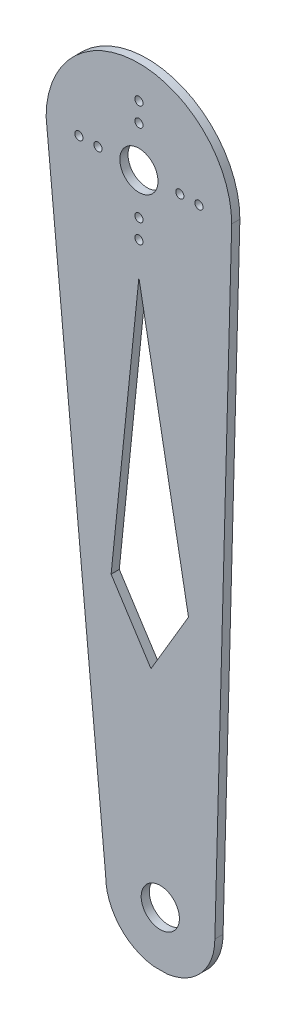
ISO-10303-21;
HEADER;
FILE_DESCRIPTION(('STEP AP214'),'2;1');
FILE_NAME('part.step','',(''),(''),'','','');
FILE_SCHEMA(('AUTOMOTIVE_DESIGN { 1 0 10303 214 1 1 1 1 }'));
ENDSEC;
DATA;
#1=APPLICATION_CONTEXT('core data for automotive mechanical design processes');
#2=APPLICATION_PROTOCOL_DEFINITION('international standard','automotive_design',2000,#1);
#3=PRODUCT_CONTEXT('',#1,'mechanical');
#4=PRODUCT('Part','Part','',(#3));
#5=PRODUCT_RELATED_PRODUCT_CATEGORY('part','',(#4));
#6=PRODUCT_DEFINITION_FORMATION('','',#4);
#7=PRODUCT_DEFINITION_CONTEXT('part definition',#1,'design');
#8=PRODUCT_DEFINITION('design','',#6,#7);
#9=PRODUCT_DEFINITION_SHAPE('','',#8);
#10=(LENGTH_UNIT() NAMED_UNIT(*) SI_UNIT(.MILLI.,.METRE.));
#11=(NAMED_UNIT(*) PLANE_ANGLE_UNIT() SI_UNIT($,.RADIAN.));
#12=(NAMED_UNIT(*) SI_UNIT($,.STERADIAN.) SOLID_ANGLE_UNIT());
#13=UNCERTAINTY_MEASURE_WITH_UNIT(LENGTH_MEASURE(1.E-05),#10,'distance_accuracy_value','');
#14=(GEOMETRIC_REPRESENTATION_CONTEXT(3) GLOBAL_UNCERTAINTY_ASSIGNED_CONTEXT((#13)) GLOBAL_UNIT_ASSIGNED_CONTEXT((#10,
#11,#12)) REPRESENTATION_CONTEXT('',''));
#15=CARTESIAN_POINT('',(0.,0.,0.));
#16=DIRECTION('',(0.,0.,1.));
#17=DIRECTION('',(1.,0.,0.));
#18=AXIS2_PLACEMENT_3D('',#15,#16,#17);
#19=CARTESIAN_POINT('',(-25.5183201991251,-249.856080790033,3.));
#20=DIRECTION('',(0.,1.,0.));
#21=DIRECTION('',(-1.,0.,0.));
#22=AXIS2_PLACEMENT_3D('',#19,#20,#21);
#23=PLANE('',#22);
#24=DIRECTION('',(0.,0.,1.));
#25=VECTOR('',#24,1.);
#26=CARTESIAN_POINT('',(10.3611541963487,-249.856080790033,0.));
#27=LINE('',#26,#25);
#28=CARTESIAN_POINT('',(10.3611541963487,-249.856080790033,0.));
#29=VERTEX_POINT('',#28);
#30=CARTESIAN_POINT('',(10.3611541963487,-249.856080790033,3.));
#31=VERTEX_POINT('',#30);
#32=EDGE_CURVE('E241',#29,#31,#27,.T.);
#33=ORIENTED_EDGE('',*,*,#32,.T.);
#34=DIRECTION('',(1.,0.,0.));
#35=VECTOR('',#34,1.);
#36=CARTESIAN_POINT('',(-25.5183201991251,-249.856080790033,3.));
#37=LINE('',#36,#35);
#38=CARTESIAN_POINT('',(5.29446066926904,-249.856080790033,3.));
#39=VERTEX_POINT('',#38);
#40=EDGE_CURVE('E279',#39,#31,#37,.T.);
#41=ORIENTED_EDGE('',*,*,#40,.F.);
#42=DIRECTION('',(0.,0.,1.));
#43=VECTOR('',#42,1.);
#44=CARTESIAN_POINT('',(5.29446066926904,-249.856080790033,0.));
#45=LINE('',#44,#43);
#46=CARTESIAN_POINT('',(5.29446066926904,-249.856080790033,0.));
#47=VERTEX_POINT('',#46);
#48=EDGE_CURVE('E269',#47,#39,#45,.T.);
#49=ORIENTED_EDGE('',*,*,#48,.F.);
#50=DIRECTION('',(1.,0.,0.));
#51=VECTOR('',#50,1.);
#52=CARTESIAN_POINT('',(-25.5183201991251,-249.856080790033,0.));
#53=LINE('',#52,#51);
#54=EDGE_CURVE('E280',#47,#29,#53,.T.);
#55=ORIENTED_EDGE('',*,*,#54,.T.);
#56=EDGE_LOOP('',(#33,#41,#49,#55));
#57=FACE_BOUND('',#56,.T.);
#58=ADVANCED_FACE('F38',(#57),#23,.F.);
#59=CARTESIAN_POINT('',(0.,0.,3.));
#60=DIRECTION('',(0.,0.,-1.));
#61=DIRECTION('',(-1.,0.,0.));
#62=AXIS2_PLACEMENT_3D('',#59,#60,#61);
#63=PLANE('',#62);
#64=CARTESIAN_POINT('',(0.,0.,3.));
#65=DIRECTION('',(0.,0.,1.));
#66=DIRECTION('',(1.,0.,0.));
#67=AXIS2_PLACEMENT_3D('',#64,#65,#66);
#68=CIRCLE('',#67,7.);
#69=CARTESIAN_POINT('',(7.,0.,3.));
#70=VERTEX_POINT('',#69);
#71=EDGE_CURVE('E394',#70,#70,#68,.T.);
#72=ORIENTED_EDGE('',*,*,#71,.F.);
#73=EDGE_LOOP('',(#72));
#74=FACE_BOUND('',#73,.T.);
#75=CARTESIAN_POINT('',(7.82780743280886,-230.017175725094,3.));
#76=DIRECTION('',(0.,0.,1.));
#77=DIRECTION('',(1.,0.,0.));
#78=AXIS2_PLACEMENT_3D('',#75,#76,#77);
#79=CIRCLE('',#78,7.);
#80=CARTESIAN_POINT('',(14.8278074328089,-230.017175725094,3.));
#81=VERTEX_POINT('',#80);
#82=EDGE_CURVE('E144',#81,#81,#79,.T.);
#83=ORIENTED_EDGE('',*,*,#82,.F.);
#84=EDGE_LOOP('',(#83));
#85=FACE_BOUND('',#84,.T.);
#86=DIRECTION('',(-0.102087088362286,-0.99477546531351,0.));
#87=VECTOR('',#86,1.);
#88=CARTESIAN_POINT('',(0.,-34.,3.));
#89=LINE('',#88,#87);
#90=CARTESIAN_POINT('',(0.,-34.,3.));
#91=VERTEX_POINT('',#90);
#92=CARTESIAN_POINT('',(-10.1834723270797,-133.231632375758,3.));
#93=VERTEX_POINT('',#92);
#94=EDGE_CURVE('E153',#91,#93,#89,.T.);
#95=ORIENTED_EDGE('',*,*,#94,.F.);
#96=DIRECTION('',(-0.181020469116553,0.983479328588468,0.));
#97=VECTOR('',#96,1.);
#98=CARTESIAN_POINT('',(18.1669669850263,-132.700641867295,3.));
#99=LINE('',#98,#97);
#100=CARTESIAN_POINT('',(18.1669669850263,-132.700641867295,3.));
#101=VERTEX_POINT('',#100);
#102=EDGE_CURVE('E55',#101,#91,#99,.T.);
#103=ORIENTED_EDGE('',*,*,#102,.F.);
#104=DIRECTION('',(0.509071340543414,0.860724328828535,0.));
#105=VECTOR('',#104,1.);
#106=CARTESIAN_POINT('',(4.42204079035416,-155.940198745665,3.));
#107=LINE('',#106,#105);
#108=CARTESIAN_POINT('',(4.42204079035416,-155.940198745665,3.));
#109=VERTEX_POINT('',#108);
#110=EDGE_CURVE('E137',#109,#101,#107,.T.);
#111=ORIENTED_EDGE('',*,*,#110,.F.);
#112=DIRECTION('',(0.540944930275327,-0.841058013700257,0.));
#113=VECTOR('',#112,1.);
#114=CARTESIAN_POINT('',(-10.1834723270797,-133.231632375758,3.));
#115=LINE('',#114,#113);
#116=EDGE_CURVE('E141',#93,#109,#115,.T.);
#117=ORIENTED_EDGE('',*,*,#116,.F.);
#118=EDGE_LOOP('',(#95,#103,#111,#117));
#119=FACE_BOUND('',#118,.T.);
#120=CARTESIAN_POINT('',(0.,22.,3.));
#121=DIRECTION('',(0.,0.,1.));
#122=DIRECTION('',(1.,0.,0.));
#123=AXIS2_PLACEMENT_3D('',#120,#121,#122);
#124=CIRCLE('',#123,1.5);
#125=CARTESIAN_POINT('',(1.5,22.,3.));
#126=VERTEX_POINT('',#125);
#127=EDGE_CURVE('E174',#126,#126,#124,.T.);
#128=ORIENTED_EDGE('',*,*,#127,.F.);
#129=EDGE_LOOP('',(#128));
#130=FACE_BOUND('',#129,.T.);
#131=CARTESIAN_POINT('',(0.,-22.,3.));
#132=DIRECTION('',(0.,0.,1.));
#133=DIRECTION('',(1.,0.,0.));
#134=AXIS2_PLACEMENT_3D('',#131,#132,#133);
#135=CIRCLE('',#134,1.5);
#136=CARTESIAN_POINT('',(1.5,-22.,3.));
#137=VERTEX_POINT('',#136);
#138=EDGE_CURVE('E163',#137,#137,#135,.T.);
#139=ORIENTED_EDGE('',*,*,#138,.F.);
#140=EDGE_LOOP('',(#139));
#141=FACE_BOUND('',#140,.T.);
#142=CARTESIAN_POINT('',(22.,0.,3.));
#143=DIRECTION('',(0.,0.,1.));
#144=DIRECTION('',(1.,0.,0.));
#145=AXIS2_PLACEMENT_3D('',#142,#143,#144);
#146=CIRCLE('',#145,1.5);
#147=CARTESIAN_POINT('',(23.5,0.,3.));
#148=VERTEX_POINT('',#147);
#149=EDGE_CURVE('E192',#148,#148,#146,.T.);
#150=ORIENTED_EDGE('',*,*,#149,.F.);
#151=EDGE_LOOP('',(#150));
#152=FACE_BOUND('',#151,.T.);
#153=CARTESIAN_POINT('',(15.,0.,3.));
#154=DIRECTION('',(0.,0.,1.));
#155=DIRECTION('',(1.,0.,0.));
#156=AXIS2_PLACEMENT_3D('',#153,#154,#155);
#157=CIRCLE('',#156,1.5);
#158=CARTESIAN_POINT('',(16.5,0.,3.));
#159=VERTEX_POINT('',#158);
#160=EDGE_CURVE('E184',#159,#159,#157,.T.);
#161=ORIENTED_EDGE('',*,*,#160,.F.);
#162=EDGE_LOOP('',(#161));
#163=FACE_BOUND('',#162,.T.);
#164=CARTESIAN_POINT('',(0.,15.,3.));
#165=DIRECTION('',(0.,0.,1.));
#166=DIRECTION('',(1.,0.,0.));
#167=AXIS2_PLACEMENT_3D('',#164,#165,#166);
#168=CIRCLE('',#167,1.5);
#169=CARTESIAN_POINT('',(1.5,15.,3.));
#170=VERTEX_POINT('',#169);
#171=EDGE_CURVE('E222',#170,#170,#168,.T.);
#172=ORIENTED_EDGE('',*,*,#171,.F.);
#173=EDGE_LOOP('',(#172));
#174=FACE_BOUND('',#173,.T.);
#175=CARTESIAN_POINT('',(-22.,0.,3.));
#176=DIRECTION('',(0.,0.,1.));
#177=DIRECTION('',(1.,0.,0.));
#178=AXIS2_PLACEMENT_3D('',#175,#176,#177);
#179=CIRCLE('',#178,1.5);
#180=CARTESIAN_POINT('',(-20.5,0.,3.));
#181=VERTEX_POINT('',#180);
#182=EDGE_CURVE('E207',#181,#181,#179,.T.);
#183=ORIENTED_EDGE('',*,*,#182,.F.);
#184=EDGE_LOOP('',(#183));
#185=FACE_BOUND('',#184,.T.);
#186=CARTESIAN_POINT('',(-15.,0.,3.));
#187=DIRECTION('',(0.,0.,1.));
#188=DIRECTION('',(1.,0.,0.));
#189=AXIS2_PLACEMENT_3D('',#186,#187,#188);
#190=CIRCLE('',#189,1.5);
#191=CARTESIAN_POINT('',(-13.5,0.,3.));
#192=VERTEX_POINT('',#191);
#193=EDGE_CURVE('E208',#192,#192,#190,.T.);
#194=ORIENTED_EDGE('',*,*,#193,.F.);
#195=EDGE_LOOP('',(#194));
#196=FACE_BOUND('',#195,.T.);
#197=CARTESIAN_POINT('',(0.,-15.,3.));
#198=DIRECTION('',(0.,0.,1.));
#199=DIRECTION('',(1.,0.,0.));
#200=AXIS2_PLACEMENT_3D('',#197,#198,#199);
#201=CIRCLE('',#200,1.5);
#202=CARTESIAN_POINT('',(1.5,-15.,3.));
#203=VERTEX_POINT('',#202);
#204=EDGE_CURVE('E183',#203,#203,#201,.T.);
#205=ORIENTED_EDGE('',*,*,#204,.F.);
#206=EDGE_LOOP('',(#205));
#207=FACE_BOUND('',#206,.T.);
#208=CARTESIAN_POINT('',(7.82780743280886,-230.017175725094,3.));
#209=DIRECTION('',(0.,0.,1.));
#210=DIRECTION('',(1.,0.,0.));
#211=AXIS2_PLACEMENT_3D('',#208,#209,#210);
#212=CIRCLE('',#211,20.);
#213=CARTESIAN_POINT('',(27.8278074328089,-230.017175725094,3.));
#214=VERTEX_POINT('',#213);
#215=EDGE_CURVE('E173',#31,#214,#212,.T.);
#216=ORIENTED_EDGE('',*,*,#215,.T.);
#217=DIRECTION('',(-0.0268239605376165,-0.999640172832743,0.));
#218=VECTOR('',#217,1.);
#219=CARTESIAN_POINT('',(33.9755361547966,-0.911686490627974,3.));
#220=LINE('',#219,#218);
#221=CARTESIAN_POINT('',(34.,0.,3.));
#222=VERTEX_POINT('',#221);
#223=EDGE_CURVE('E237',#222,#214,#220,.T.);
#224=ORIENTED_EDGE('',*,*,#223,.F.);
#225=CARTESIAN_POINT('',(0.,0.,3.));
#226=DIRECTION('',(0.,0.,1.));
#227=DIRECTION('',(-1.,0.,0.));
#228=AXIS2_PLACEMENT_3D('',#225,#226,#227);
#229=CIRCLE('',#228,34.);
#230=CARTESIAN_POINT('',(-34.,0.,3.));
#231=VERTEX_POINT('',#230);
#232=EDGE_CURVE('E275',#222,#231,#229,.T.);
#233=ORIENTED_EDGE('',*,*,#232,.T.);
#234=DIRECTION('',(0.0944720015300833,-0.995527518919944,0.));
#235=VECTOR('',#234,1.);
#236=CARTESIAN_POINT('',(-33.6965513915146,-3.19768222788193,3.));
#237=LINE('',#236,#235);
#238=CARTESIAN_POINT('',(-12.1721925671912,-230.017175725094,3.));
#239=VERTEX_POINT('',#238);
#240=EDGE_CURVE('E259',#231,#239,#237,.T.);
#241=ORIENTED_EDGE('',*,*,#240,.T.);
#242=CARTESIAN_POINT('',(7.82780743280886,-230.017175725094,3.));
#243=DIRECTION('',(0.,0.,1.));
#244=DIRECTION('',(1.,0.,0.));
#245=AXIS2_PLACEMENT_3D('',#242,#243,#244);
#246=CIRCLE('',#245,20.);
#247=EDGE_CURVE('E251',#239,#39,#246,.T.);
#248=ORIENTED_EDGE('',*,*,#247,.T.);
#249=ORIENTED_EDGE('',*,*,#40,.T.);
#250=EDGE_LOOP('',(#216,#224,#233,#241,#248,#249));
#251=FACE_BOUND('',#250,.T.);
#252=ADVANCED_FACE('F312',(#74,#85,#119,#130,#141,#152,#163,#174,#185,#196,#207,#251),#63,.F.);
#253=CARTESIAN_POINT('',(0.,0.,0.));
#254=DIRECTION('',(0.,0.,-1.));
#255=DIRECTION('',(-1.,0.,0.));
#256=AXIS2_PLACEMENT_3D('',#253,#254,#255);
#257=PLANE('',#256);
#258=CARTESIAN_POINT('',(0.,0.,0.));
#259=DIRECTION('',(0.,0.,-1.));
#260=DIRECTION('',(-1.,0.,0.));
#261=AXIS2_PLACEMENT_3D('',#258,#259,#260);
#262=CIRCLE('',#261,7.);
#263=CARTESIAN_POINT('',(-7.,0.,0.));
#264=VERTEX_POINT('',#263);
#265=EDGE_CURVE('E42',#264,#264,#262,.T.);
#266=ORIENTED_EDGE('',*,*,#265,.F.);
#267=EDGE_LOOP('',(#266));
#268=FACE_BOUND('',#267,.T.);
#269=CARTESIAN_POINT('',(7.82780743280886,-230.017175725094,0.));
#270=DIRECTION('',(0.,0.,1.));
#271=DIRECTION('',(1.,0.,0.));
#272=AXIS2_PLACEMENT_3D('',#269,#270,#271);
#273=CIRCLE('',#272,7.);
#274=CARTESIAN_POINT('',(14.8278074328089,-230.017175725094,0.));
#275=VERTEX_POINT('',#274);
#276=EDGE_CURVE('E154',#275,#275,#273,.T.);
#277=ORIENTED_EDGE('',*,*,#276,.T.);
#278=EDGE_LOOP('',(#277));
#279=FACE_BOUND('',#278,.T.);
#280=DIRECTION('',(-0.181020469116553,0.983479328588468,0.));
#281=VECTOR('',#280,1.);
#282=CARTESIAN_POINT('',(18.1669669850263,-132.700641867295,0.));
#283=LINE('',#282,#281);
#284=CARTESIAN_POINT('',(18.1669669850263,-132.700641867295,0.));
#285=VERTEX_POINT('',#284);
#286=CARTESIAN_POINT('',(0.,-34.,0.));
#287=VERTEX_POINT('',#286);
#288=EDGE_CURVE('E118',#285,#287,#283,.T.);
#289=ORIENTED_EDGE('',*,*,#288,.T.);
#290=DIRECTION('',(-0.102087088362286,-0.99477546531351,0.));
#291=VECTOR('',#290,1.);
#292=CARTESIAN_POINT('',(0.,-34.,0.));
#293=LINE('',#292,#291);
#294=CARTESIAN_POINT('',(-10.1834723270797,-133.231632375758,0.));
#295=VERTEX_POINT('',#294);
#296=EDGE_CURVE('E128',#287,#295,#293,.T.);
#297=ORIENTED_EDGE('',*,*,#296,.T.);
#298=DIRECTION('',(0.540944930275327,-0.841058013700257,0.));
#299=VECTOR('',#298,1.);
#300=CARTESIAN_POINT('',(-10.1834723270797,-133.231632375758,0.));
#301=LINE('',#300,#299);
#302=CARTESIAN_POINT('',(4.42204079035416,-155.940198745665,0.));
#303=VERTEX_POINT('',#302);
#304=EDGE_CURVE('E63',#295,#303,#301,.T.);
#305=ORIENTED_EDGE('',*,*,#304,.T.);
#306=DIRECTION('',(0.509071340543414,0.860724328828535,0.));
#307=VECTOR('',#306,1.);
#308=CARTESIAN_POINT('',(4.42204079035416,-155.940198745665,0.));
#309=LINE('',#308,#307);
#310=EDGE_CURVE('E125',#303,#285,#309,.T.);
#311=ORIENTED_EDGE('',*,*,#310,.T.);
#312=EDGE_LOOP('',(#289,#297,#305,#311));
#313=FACE_BOUND('',#312,.T.);
#314=CARTESIAN_POINT('',(0.,22.,0.));
#315=DIRECTION('',(0.,0.,1.));
#316=DIRECTION('',(1.,0.,0.));
#317=AXIS2_PLACEMENT_3D('',#314,#315,#316);
#318=CIRCLE('',#317,1.5);
#319=CARTESIAN_POINT('',(1.5,22.,0.));
#320=VERTEX_POINT('',#319);
#321=EDGE_CURVE('E169',#320,#320,#318,.T.);
#322=ORIENTED_EDGE('',*,*,#321,.T.);
#323=EDGE_LOOP('',(#322));
#324=FACE_BOUND('',#323,.T.);
#325=CARTESIAN_POINT('',(0.,-22.,0.));
#326=DIRECTION('',(0.,0.,1.));
#327=DIRECTION('',(1.,0.,0.));
#328=AXIS2_PLACEMENT_3D('',#325,#326,#327);
#329=CIRCLE('',#328,1.5);
#330=CARTESIAN_POINT('',(1.5,-22.,0.));
#331=VERTEX_POINT('',#330);
#332=EDGE_CURVE('E196',#331,#331,#329,.T.);
#333=ORIENTED_EDGE('',*,*,#332,.T.);
#334=EDGE_LOOP('',(#333));
#335=FACE_BOUND('',#334,.T.);
#336=CARTESIAN_POINT('',(22.,0.,0.));
#337=DIRECTION('',(0.,0.,1.));
#338=DIRECTION('',(1.,0.,0.));
#339=AXIS2_PLACEMENT_3D('',#336,#337,#338);
#340=CIRCLE('',#339,1.5);
#341=CARTESIAN_POINT('',(23.5,0.,0.));
#342=VERTEX_POINT('',#341);
#343=EDGE_CURVE('E188',#342,#342,#340,.T.);
#344=ORIENTED_EDGE('',*,*,#343,.T.);
#345=EDGE_LOOP('',(#344));
#346=FACE_BOUND('',#345,.T.);
#347=CARTESIAN_POINT('',(15.,0.,0.));
#348=DIRECTION('',(0.,0.,1.));
#349=DIRECTION('',(1.,0.,0.));
#350=AXIS2_PLACEMENT_3D('',#347,#348,#349);
#351=CIRCLE('',#350,1.5);
#352=CARTESIAN_POINT('',(16.5,0.,0.));
#353=VERTEX_POINT('',#352);
#354=EDGE_CURVE('E179',#353,#353,#351,.T.);
#355=ORIENTED_EDGE('',*,*,#354,.T.);
#356=EDGE_LOOP('',(#355));
#357=FACE_BOUND('',#356,.T.);
#358=CARTESIAN_POINT('',(0.,15.,0.));
#359=DIRECTION('',(0.,0.,1.));
#360=DIRECTION('',(1.,0.,0.));
#361=AXIS2_PLACEMENT_3D('',#358,#359,#360);
#362=CIRCLE('',#361,1.5);
#363=CARTESIAN_POINT('',(1.5,15.,0.));
#364=VERTEX_POINT('',#363);
#365=EDGE_CURVE('E178',#364,#364,#362,.T.);
#366=ORIENTED_EDGE('',*,*,#365,.T.);
#367=EDGE_LOOP('',(#366));
#368=FACE_BOUND('',#367,.T.);
#369=CARTESIAN_POINT('',(-22.,0.,0.));
#370=DIRECTION('',(0.,0.,1.));
#371=DIRECTION('',(1.,0.,0.));
#372=AXIS2_PLACEMENT_3D('',#369,#370,#371);
#373=CIRCLE('',#372,1.5);
#374=CARTESIAN_POINT('',(-20.5,0.,0.));
#375=VERTEX_POINT('',#374);
#376=EDGE_CURVE('E226',#375,#375,#373,.T.);
#377=ORIENTED_EDGE('',*,*,#376,.T.);
#378=EDGE_LOOP('',(#377));
#379=FACE_BOUND('',#378,.T.);
#380=CARTESIAN_POINT('',(-15.,0.,0.));
#381=DIRECTION('',(0.,0.,1.));
#382=DIRECTION('',(1.,0.,0.));
#383=AXIS2_PLACEMENT_3D('',#380,#381,#382);
#384=CIRCLE('',#383,1.5);
#385=CARTESIAN_POINT('',(-13.5,0.,0.));
#386=VERTEX_POINT('',#385);
#387=EDGE_CURVE('E203',#386,#386,#384,.T.);
#388=ORIENTED_EDGE('',*,*,#387,.T.);
#389=EDGE_LOOP('',(#388));
#390=FACE_BOUND('',#389,.T.);
#391=CARTESIAN_POINT('',(0.,-15.,0.));
#392=DIRECTION('',(0.,0.,1.));
#393=DIRECTION('',(1.,0.,0.));
#394=AXIS2_PLACEMENT_3D('',#391,#392,#393);
#395=CIRCLE('',#394,1.5);
#396=CARTESIAN_POINT('',(1.5,-15.,0.));
#397=VERTEX_POINT('',#396);
#398=EDGE_CURVE('E212',#397,#397,#395,.T.);
#399=ORIENTED_EDGE('',*,*,#398,.T.);
#400=EDGE_LOOP('',(#399));
#401=FACE_BOUND('',#400,.T.);
#402=DIRECTION('',(-0.0268239605376165,-0.999640172832743,0.));
#403=VECTOR('',#402,1.);
#404=CARTESIAN_POINT('',(33.9755361547966,-0.911686490627974,0.));
#405=LINE('',#404,#403);
#406=CARTESIAN_POINT('',(34.,0.,0.));
#407=VERTEX_POINT('',#406);
#408=CARTESIAN_POINT('',(27.8278074328089,-230.017175725094,0.));
#409=VERTEX_POINT('',#408);
#410=EDGE_CURVE('E236',#407,#409,#405,.T.);
#411=ORIENTED_EDGE('',*,*,#410,.T.);
#412=CARTESIAN_POINT('',(7.82780743280886,-230.017175725094,0.));
#413=DIRECTION('',(0.,0.,1.));
#414=DIRECTION('',(1.,0.,0.));
#415=AXIS2_PLACEMENT_3D('',#412,#413,#414);
#416=CIRCLE('',#415,20.);
#417=EDGE_CURVE('E233',#29,#409,#416,.T.);
#418=ORIENTED_EDGE('',*,*,#417,.F.);
#419=ORIENTED_EDGE('',*,*,#54,.F.);
#420=CARTESIAN_POINT('',(7.82780743280886,-230.017175725094,0.));
#421=DIRECTION('',(0.,0.,1.));
#422=DIRECTION('',(1.,0.,0.));
#423=AXIS2_PLACEMENT_3D('',#420,#421,#422);
#424=CIRCLE('',#423,20.);
#425=CARTESIAN_POINT('',(-12.1721925671912,-230.017175725094,0.));
#426=VERTEX_POINT('',#425);
#427=EDGE_CURVE('E255',#426,#47,#424,.T.);
#428=ORIENTED_EDGE('',*,*,#427,.F.);
#429=DIRECTION('',(0.0944720015300833,-0.995527518919944,0.));
#430=VECTOR('',#429,1.);
#431=CARTESIAN_POINT('',(-33.6965513915146,-3.19768222788193,0.));
#432=LINE('',#431,#430);
#433=CARTESIAN_POINT('',(-34.,0.,0.));
#434=VERTEX_POINT('',#433);
#435=EDGE_CURVE('E258',#434,#426,#432,.T.);
#436=ORIENTED_EDGE('',*,*,#435,.F.);
#437=CARTESIAN_POINT('',(0.,0.,0.));
#438=DIRECTION('',(0.,0.,1.));
#439=DIRECTION('',(-1.,0.,0.));
#440=AXIS2_PLACEMENT_3D('',#437,#438,#439);
#441=CIRCLE('',#440,34.);
#442=EDGE_CURVE('E272',#407,#434,#441,.T.);
#443=ORIENTED_EDGE('',*,*,#442,.F.);
#444=EDGE_LOOP('',(#411,#418,#419,#428,#436,#443));
#445=FACE_BOUND('',#444,.T.);
#446=ADVANCED_FACE('F133',(#268,#279,#313,#324,#335,#346,#357,#368,#379,#390,#401,#445),#257,.T.);
#447=CARTESIAN_POINT('',(0.,0.,3.));
#448=DIRECTION('',(0.,0.,-1.));
#449=DIRECTION('',(-1.,0.,0.));
#450=AXIS2_PLACEMENT_3D('',#447,#448,#449);
#451=CYLINDRICAL_SURFACE('',#450,34.);
#452=ORIENTED_EDGE('',*,*,#442,.T.);
#453=DIRECTION('',(0.,0.,-1.));
#454=VECTOR('',#453,1.);
#455=CARTESIAN_POINT('',(-34.,0.,3.));
#456=LINE('',#455,#454);
#457=EDGE_CURVE('E11',#231,#434,#456,.T.);
#458=ORIENTED_EDGE('',*,*,#457,.F.);
#459=ORIENTED_EDGE('',*,*,#232,.F.);
#460=DIRECTION('',(0.,0.,-1.));
#461=VECTOR('',#460,1.);
#462=CARTESIAN_POINT('',(34.,0.,3.));
#463=LINE('',#462,#461);
#464=EDGE_CURVE('E48',#222,#407,#463,.T.);
#465=ORIENTED_EDGE('',*,*,#464,.T.);
#466=EDGE_LOOP('',(#452,#458,#459,#465));
#467=FACE_BOUND('',#466,.T.);
#468=ADVANCED_FACE('F40',(#467),#451,.T.);
#469=CARTESIAN_POINT('',(7.82780743280886,-230.017175725094,0.));
#470=DIRECTION('',(0.,0.,1.));
#471=DIRECTION('',(1.,0.,0.));
#472=AXIS2_PLACEMENT_3D('',#469,#470,#471);
#473=CYLINDRICAL_SURFACE('',#472,20.);
#474=ORIENTED_EDGE('',*,*,#247,.F.);
#475=DIRECTION('',(0.,0.,1.));
#476=VECTOR('',#475,1.);
#477=CARTESIAN_POINT('',(-12.1721925671912,-230.017175725094,0.));
#478=LINE('',#477,#476);
#479=EDGE_CURVE('E262',#426,#239,#478,.T.);
#480=ORIENTED_EDGE('',*,*,#479,.F.);
#481=ORIENTED_EDGE('',*,*,#427,.T.);
#482=ORIENTED_EDGE('',*,*,#48,.T.);
#483=EDGE_LOOP('',(#474,#480,#481,#482));
#484=FACE_BOUND('',#483,.T.);
#485=ADVANCED_FACE('F308',(#484),#473,.T.);
#486=CARTESIAN_POINT('',(-33.6965513915146,-3.19768222788193,0.));
#487=DIRECTION('',(-0.995527518919944,-0.0944720015300833,0.));
#488=DIRECTION('',(0.0944720015300833,-0.995527518919944,0.));
#489=AXIS2_PLACEMENT_3D('',#486,#487,#488);
#490=PLANE('',#489);
#491=ORIENTED_EDGE('',*,*,#240,.F.);
#492=ORIENTED_EDGE('',*,*,#457,.T.);
#493=ORIENTED_EDGE('',*,*,#435,.T.);
#494=ORIENTED_EDGE('',*,*,#479,.T.);
#495=EDGE_LOOP('',(#491,#492,#493,#494));
#496=FACE_BOUND('',#495,.T.);
#497=ADVANCED_FACE('F305',(#496),#490,.T.);
#498=CARTESIAN_POINT('',(7.82780743280886,-230.017175725094,0.));
#499=DIRECTION('',(0.,0.,1.));
#500=DIRECTION('',(1.,0.,0.));
#501=AXIS2_PLACEMENT_3D('',#498,#499,#500);
#502=CYLINDRICAL_SURFACE('',#501,20.);
#503=ORIENTED_EDGE('',*,*,#215,.F.);
#504=ORIENTED_EDGE('',*,*,#32,.F.);
#505=ORIENTED_EDGE('',*,*,#417,.T.);
#506=DIRECTION('',(0.,0.,1.));
#507=VECTOR('',#506,1.);
#508=CARTESIAN_POINT('',(27.8278074328089,-230.017175725094,0.));
#509=LINE('',#508,#507);
#510=EDGE_CURVE('E248',#409,#214,#509,.T.);
#511=ORIENTED_EDGE('',*,*,#510,.T.);
#512=EDGE_LOOP('',(#503,#504,#505,#511));
#513=FACE_BOUND('',#512,.T.);
#514=ADVANCED_FACE('F316',(#513),#502,.T.);
#515=CARTESIAN_POINT('',(33.9755361547966,-0.911686490627974,0.));
#516=DIRECTION('',(-0.999640172832743,0.0268239605376165,0.));
#517=DIRECTION('',(-0.0268239605376165,-0.999640172832743,0.));
#518=AXIS2_PLACEMENT_3D('',#515,#516,#517);
#519=PLANE('',#518);
#520=ORIENTED_EDGE('',*,*,#223,.T.);
#521=ORIENTED_EDGE('',*,*,#510,.F.);
#522=ORIENTED_EDGE('',*,*,#410,.F.);
#523=ORIENTED_EDGE('',*,*,#464,.F.);
#524=EDGE_LOOP('',(#520,#521,#522,#523));
#525=FACE_BOUND('',#524,.T.);
#526=ADVANCED_FACE('F314',(#525),#519,.F.);
#527=CARTESIAN_POINT('',(0.,-15.,0.));
#528=DIRECTION('',(0.,0.,1.));
#529=DIRECTION('',(1.,0.,0.));
#530=AXIS2_PLACEMENT_3D('',#527,#528,#529);
#531=CYLINDRICAL_SURFACE('',#530,1.5);
#532=ORIENTED_EDGE('',*,*,#398,.F.);
#533=EDGE_LOOP('',(#532));
#534=FACE_BOUND('',#533,.T.);
#535=ORIENTED_EDGE('',*,*,#204,.T.);
#536=EDGE_LOOP('',(#535));
#537=FACE_BOUND('',#536,.T.);
#538=ADVANCED_FACE('F337',(#534,#537),#531,.F.);
#539=CARTESIAN_POINT('',(-15.,0.,0.));
#540=DIRECTION('',(0.,0.,1.));
#541=DIRECTION('',(1.,0.,0.));
#542=AXIS2_PLACEMENT_3D('',#539,#540,#541);
#543=CYLINDRICAL_SURFACE('',#542,1.5);
#544=ORIENTED_EDGE('',*,*,#387,.F.);
#545=EDGE_LOOP('',(#544));
#546=FACE_BOUND('',#545,.T.);
#547=ORIENTED_EDGE('',*,*,#193,.T.);
#548=EDGE_LOOP('',(#547));
#549=FACE_BOUND('',#548,.T.);
#550=ADVANCED_FACE('F342',(#546,#549),#543,.F.);
#551=CARTESIAN_POINT('',(-22.,0.,0.));
#552=DIRECTION('',(0.,0.,1.));
#553=DIRECTION('',(1.,0.,0.));
#554=AXIS2_PLACEMENT_3D('',#551,#552,#553);
#555=CYLINDRICAL_SURFACE('',#554,1.5);
#556=ORIENTED_EDGE('',*,*,#376,.F.);
#557=EDGE_LOOP('',(#556));
#558=FACE_BOUND('',#557,.T.);
#559=ORIENTED_EDGE('',*,*,#182,.T.);
#560=EDGE_LOOP('',(#559));
#561=FACE_BOUND('',#560,.T.);
#562=ADVANCED_FACE('F338',(#558,#561),#555,.F.);
#563=CARTESIAN_POINT('',(0.,15.,0.));
#564=DIRECTION('',(0.,0.,1.));
#565=DIRECTION('',(1.,0.,0.));
#566=AXIS2_PLACEMENT_3D('',#563,#564,#565);
#567=CYLINDRICAL_SURFACE('',#566,1.5);
#568=ORIENTED_EDGE('',*,*,#365,.F.);
#569=EDGE_LOOP('',(#568));
#570=FACE_BOUND('',#569,.T.);
#571=ORIENTED_EDGE('',*,*,#171,.T.);
#572=EDGE_LOOP('',(#571));
#573=FACE_BOUND('',#572,.T.);
#574=ADVANCED_FACE('F341',(#570,#573),#567,.F.);
#575=CARTESIAN_POINT('',(15.,0.,0.));
#576=DIRECTION('',(0.,0.,1.));
#577=DIRECTION('',(1.,0.,0.));
#578=AXIS2_PLACEMENT_3D('',#575,#576,#577);
#579=CYLINDRICAL_SURFACE('',#578,1.5);
#580=ORIENTED_EDGE('',*,*,#354,.F.);
#581=EDGE_LOOP('',(#580));
#582=FACE_BOUND('',#581,.T.);
#583=ORIENTED_EDGE('',*,*,#160,.T.);
#584=EDGE_LOOP('',(#583));
#585=FACE_BOUND('',#584,.T.);
#586=ADVANCED_FACE('F346',(#582,#585),#579,.F.);
#587=CARTESIAN_POINT('',(22.,0.,0.));
#588=DIRECTION('',(0.,0.,1.));
#589=DIRECTION('',(1.,0.,0.));
#590=AXIS2_PLACEMENT_3D('',#587,#588,#589);
#591=CYLINDRICAL_SURFACE('',#590,1.5);
#592=ORIENTED_EDGE('',*,*,#343,.F.);
#593=EDGE_LOOP('',(#592));
#594=FACE_BOUND('',#593,.T.);
#595=ORIENTED_EDGE('',*,*,#149,.T.);
#596=EDGE_LOOP('',(#595));
#597=FACE_BOUND('',#596,.T.);
#598=ADVANCED_FACE('F358',(#594,#597),#591,.F.);
#599=CARTESIAN_POINT('',(0.,-22.,0.));
#600=DIRECTION('',(0.,0.,1.));
#601=DIRECTION('',(1.,0.,0.));
#602=AXIS2_PLACEMENT_3D('',#599,#600,#601);
#603=CYLINDRICAL_SURFACE('',#602,1.5);
#604=ORIENTED_EDGE('',*,*,#332,.F.);
#605=EDGE_LOOP('',(#604));
#606=FACE_BOUND('',#605,.T.);
#607=ORIENTED_EDGE('',*,*,#138,.T.);
#608=EDGE_LOOP('',(#607));
#609=FACE_BOUND('',#608,.T.);
#610=ADVANCED_FACE('F354',(#606,#609),#603,.F.);
#611=CARTESIAN_POINT('',(0.,22.,0.));
#612=DIRECTION('',(0.,0.,1.));
#613=DIRECTION('',(1.,0.,0.));
#614=AXIS2_PLACEMENT_3D('',#611,#612,#613);
#615=CYLINDRICAL_SURFACE('',#614,1.5);
#616=ORIENTED_EDGE('',*,*,#321,.F.);
#617=EDGE_LOOP('',(#616));
#618=FACE_BOUND('',#617,.T.);
#619=ORIENTED_EDGE('',*,*,#127,.T.);
#620=EDGE_LOOP('',(#619));
#621=FACE_BOUND('',#620,.T.);
#622=ADVANCED_FACE('F357',(#618,#621),#615,.F.);
#623=CARTESIAN_POINT('',(18.1669669850263,-132.700641867295,0.));
#624=DIRECTION('',(0.983479328588468,0.181020469116553,0.));
#625=DIRECTION('',(-0.181020469116553,0.983479328588468,0.));
#626=AXIS2_PLACEMENT_3D('',#623,#624,#625);
#627=PLANE('',#626);
#628=ORIENTED_EDGE('',*,*,#102,.T.);
#629=DIRECTION('',(0.,0.,1.));
#630=VECTOR('',#629,1.);
#631=CARTESIAN_POINT('',(0.,-34.,0.));
#632=LINE('',#631,#630);
#633=EDGE_CURVE('E114',#287,#91,#632,.T.);
#634=ORIENTED_EDGE('',*,*,#633,.F.);
#635=ORIENTED_EDGE('',*,*,#288,.F.);
#636=DIRECTION('',(0.,0.,1.));
#637=VECTOR('',#636,1.);
#638=CARTESIAN_POINT('',(18.1669669850263,-132.700641867295,0.));
#639=LINE('',#638,#637);
#640=EDGE_CURVE('E160',#285,#101,#639,.T.);
#641=ORIENTED_EDGE('',*,*,#640,.T.);
#642=EDGE_LOOP('',(#628,#634,#635,#641));
#643=FACE_BOUND('',#642,.T.);
#644=ADVANCED_FACE('F116',(#643),#627,.F.);
#645=CARTESIAN_POINT('',(4.42204079035416,-155.940198745665,0.));
#646=DIRECTION('',(0.860724328828535,-0.509071340543414,0.));
#647=DIRECTION('',(0.509071340543414,0.860724328828535,0.));
#648=AXIS2_PLACEMENT_3D('',#645,#646,#647);
#649=PLANE('',#648);
#650=ORIENTED_EDGE('',*,*,#110,.T.);
#651=ORIENTED_EDGE('',*,*,#640,.F.);
#652=ORIENTED_EDGE('',*,*,#310,.F.);
#653=DIRECTION('',(0.,0.,1.));
#654=VECTOR('',#653,1.);
#655=CARTESIAN_POINT('',(4.42204079035416,-155.940198745665,0.));
#656=LINE('',#655,#654);
#657=EDGE_CURVE('E164',#303,#109,#656,.T.);
#658=ORIENTED_EDGE('',*,*,#657,.T.);
#659=EDGE_LOOP('',(#650,#651,#652,#658));
#660=FACE_BOUND('',#659,.T.);
#661=ADVANCED_FACE('F371',(#660),#649,.F.);
#662=CARTESIAN_POINT('',(-10.1834723270797,-133.231632375758,0.));
#663=DIRECTION('',(-0.841058013700257,-0.540944930275327,0.));
#664=DIRECTION('',(0.540944930275327,-0.841058013700257,0.));
#665=AXIS2_PLACEMENT_3D('',#662,#663,#664);
#666=PLANE('',#665);
#667=ORIENTED_EDGE('',*,*,#116,.T.);
#668=ORIENTED_EDGE('',*,*,#657,.F.);
#669=ORIENTED_EDGE('',*,*,#304,.F.);
#670=DIRECTION('',(0.,0.,1.));
#671=VECTOR('',#670,1.);
#672=CARTESIAN_POINT('',(-10.1834723270797,-133.231632375758,0.));
#673=LINE('',#672,#671);
#674=EDGE_CURVE('E124',#295,#93,#673,.T.);
#675=ORIENTED_EDGE('',*,*,#674,.T.);
#676=EDGE_LOOP('',(#667,#668,#669,#675));
#677=FACE_BOUND('',#676,.T.);
#678=ADVANCED_FACE('F375',(#677),#666,.F.);
#679=CARTESIAN_POINT('',(0.,-34.,0.));
#680=DIRECTION('',(-0.99477546531351,0.102087088362286,0.));
#681=DIRECTION('',(-0.102087088362286,-0.99477546531351,0.));
#682=AXIS2_PLACEMENT_3D('',#679,#680,#681);
#683=PLANE('',#682);
#684=ORIENTED_EDGE('',*,*,#94,.T.);
#685=ORIENTED_EDGE('',*,*,#674,.F.);
#686=ORIENTED_EDGE('',*,*,#296,.F.);
#687=ORIENTED_EDGE('',*,*,#633,.T.);
#688=EDGE_LOOP('',(#684,#685,#686,#687));
#689=FACE_BOUND('',#688,.T.);
#690=ADVANCED_FACE('F129',(#689),#683,.F.);
#691=CARTESIAN_POINT('',(7.82780743280886,-230.017175725094,0.));
#692=DIRECTION('',(0.,0.,1.));
#693=DIRECTION('',(1.,0.,0.));
#694=AXIS2_PLACEMENT_3D('',#691,#692,#693);
#695=CYLINDRICAL_SURFACE('',#694,7.);
#696=ORIENTED_EDGE('',*,*,#276,.F.);
#697=EDGE_LOOP('',(#696));
#698=FACE_BOUND('',#697,.T.);
#699=ORIENTED_EDGE('',*,*,#82,.T.);
#700=EDGE_LOOP('',(#699));
#701=FACE_BOUND('',#700,.T.);
#702=ADVANCED_FACE('F374',(#698,#701),#695,.F.);
#703=CARTESIAN_POINT('',(0.,0.,-7.));
#704=DIRECTION('',(0.,0.,1.));
#705=DIRECTION('',(1.,0.,0.));
#706=AXIS2_PLACEMENT_3D('',#703,#704,#705);
#707=CYLINDRICAL_SURFACE('',#706,7.);
#708=ORIENTED_EDGE('',*,*,#265,.T.);
#709=EDGE_LOOP('',(#708));
#710=FACE_BOUND('',#709,.T.);
#711=ORIENTED_EDGE('',*,*,#71,.T.);
#712=EDGE_LOOP('',(#711));
#713=FACE_BOUND('',#712,.T.);
#714=ADVANCED_FACE('F383',(#710,#713),#707,.F.);
#715=CLOSED_SHELL('',(#58,#252,#446,#468,#485,#497,#514,#526,#538,#550,#562,#574,#586,#598,#610,
#622,#644,#661,#678,#690,#702,#714));
#716=MANIFOLD_SOLID_BREP('B2',#715);
#717=ADVANCED_BREP_SHAPE_REPRESENTATION('',(#18,#716),#14);
#718=SHAPE_DEFINITION_REPRESENTATION(#9,#717);
ENDSEC;
END-ISO-10303-21;
